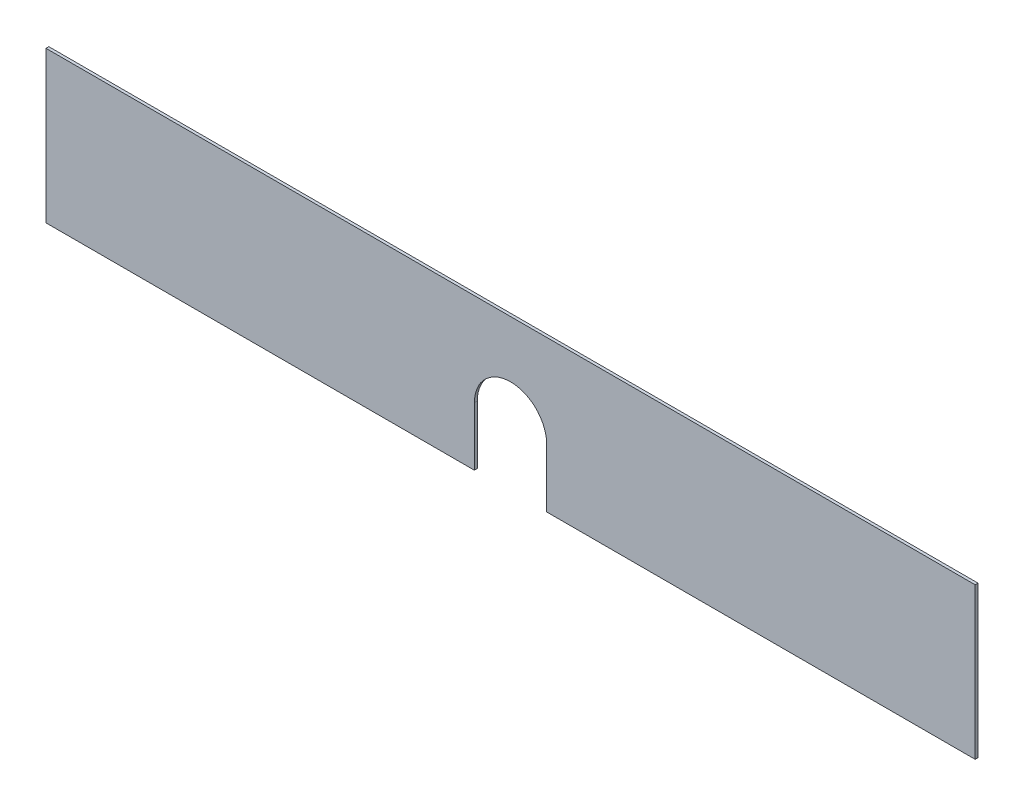
ISO-10303-21;
HEADER;
FILE_DESCRIPTION(('STEP AP214'),'2;1');
FILE_NAME('part.step','',(''),(''),'','','');
FILE_SCHEMA(('AUTOMOTIVE_DESIGN { 1 0 10303 214 1 1 1 1 }'));
ENDSEC;
DATA;
#1=APPLICATION_CONTEXT('core data for automotive mechanical design processes');
#2=APPLICATION_PROTOCOL_DEFINITION('international standard','automotive_design',2000,#1);
#3=PRODUCT_CONTEXT('',#1,'mechanical');
#4=PRODUCT('Part','Part','',(#3));
#5=PRODUCT_RELATED_PRODUCT_CATEGORY('part','',(#4));
#6=PRODUCT_DEFINITION_FORMATION('','',#4);
#7=PRODUCT_DEFINITION_CONTEXT('part definition',#1,'design');
#8=PRODUCT_DEFINITION('design','',#6,#7);
#9=PRODUCT_DEFINITION_SHAPE('','',#8);
#10=(LENGTH_UNIT() NAMED_UNIT(*) SI_UNIT(.MILLI.,.METRE.));
#11=(NAMED_UNIT(*) PLANE_ANGLE_UNIT() SI_UNIT($,.RADIAN.));
#12=(NAMED_UNIT(*) SI_UNIT($,.STERADIAN.) SOLID_ANGLE_UNIT());
#13=UNCERTAINTY_MEASURE_WITH_UNIT(LENGTH_MEASURE(1.E-05),#10,'distance_accuracy_value','');
#14=(GEOMETRIC_REPRESENTATION_CONTEXT(3) GLOBAL_UNCERTAINTY_ASSIGNED_CONTEXT((#13)) GLOBAL_UNIT_ASSIGNED_CONTEXT((#10,
#11,#12)) REPRESENTATION_CONTEXT('',''));
#15=CARTESIAN_POINT('',(0.,0.,0.));
#16=DIRECTION('',(0.,0.,1.));
#17=DIRECTION('',(1.,0.,0.));
#18=AXIS2_PLACEMENT_3D('',#15,#16,#17);
#19=CARTESIAN_POINT('',(150.175,0.,1.));
#20=DIRECTION('',(0.,1.,0.));
#21=DIRECTION('',(-1.,0.,0.));
#22=AXIS2_PLACEMENT_3D('',#19,#20,#21);
#23=PLANE('',#22);
#24=DIRECTION('',(1.,0.,0.));
#25=VECTOR('',#24,1.);
#26=CARTESIAN_POINT('',(150.175,0.,0.));
#27=LINE('',#26,#25);
#28=CARTESIAN_POINT('',(0.,0.,0.));
#29=VERTEX_POINT('',#28);
#30=CARTESIAN_POINT('',(150.175,0.,0.));
#31=VERTEX_POINT('',#30);
#32=EDGE_CURVE('E131',#29,#31,#27,.T.);
#33=ORIENTED_EDGE('',*,*,#32,.T.);
#34=DIRECTION('',(0.,0.,-1.));
#35=VECTOR('',#34,1.);
#36=CARTESIAN_POINT('',(150.175,0.,1.));
#37=LINE('',#36,#35);
#38=CARTESIAN_POINT('',(150.175,0.,1.));
#39=VERTEX_POINT('',#38);
#40=EDGE_CURVE('E11',#39,#31,#37,.T.);
#41=ORIENTED_EDGE('',*,*,#40,.F.);
#42=DIRECTION('',(1.,0.,0.));
#43=VECTOR('',#42,1.);
#44=CARTESIAN_POINT('',(150.175,0.,1.));
#45=LINE('',#44,#43);
#46=CARTESIAN_POINT('',(0.,0.,1.));
#47=VERTEX_POINT('',#46);
#48=EDGE_CURVE('E145',#47,#39,#45,.T.);
#49=ORIENTED_EDGE('',*,*,#48,.F.);
#50=DIRECTION('',(0.,0.,-1.));
#51=VECTOR('',#50,1.);
#52=CARTESIAN_POINT('',(0.,0.,1.));
#53=LINE('',#52,#51);
#54=EDGE_CURVE('E127',#47,#29,#53,.T.);
#55=ORIENTED_EDGE('',*,*,#54,.T.);
#56=EDGE_LOOP('',(#33,#41,#49,#55));
#57=FACE_BOUND('',#56,.T.);
#58=ADVANCED_FACE('F35',(#57),#23,.F.);
#59=CARTESIAN_POINT('',(150.175,20.5,1.));
#60=DIRECTION('',(-1.,0.,0.));
#61=DIRECTION('',(0.,0.,1.));
#62=AXIS2_PLACEMENT_3D('',#59,#60,#61);
#63=PLANE('',#62);
#64=DIRECTION('',(0.,1.,0.));
#65=VECTOR('',#64,1.);
#66=CARTESIAN_POINT('',(150.175,20.5,0.));
#67=LINE('',#66,#65);
#68=CARTESIAN_POINT('',(150.175,20.5,0.));
#69=VERTEX_POINT('',#68);
#70=EDGE_CURVE('E134',#31,#69,#67,.T.);
#71=ORIENTED_EDGE('',*,*,#70,.T.);
#72=DIRECTION('',(0.,0.,-1.));
#73=VECTOR('',#72,1.);
#74=CARTESIAN_POINT('',(150.175,20.5,1.));
#75=LINE('',#74,#73);
#76=CARTESIAN_POINT('',(150.175,20.5,1.));
#77=VERTEX_POINT('',#76);
#78=EDGE_CURVE('E43',#77,#69,#75,.T.);
#79=ORIENTED_EDGE('',*,*,#78,.F.);
#80=DIRECTION('',(0.,1.,0.));
#81=VECTOR('',#80,1.);
#82=CARTESIAN_POINT('',(150.175,20.5,1.));
#83=LINE('',#82,#81);
#84=EDGE_CURVE('E94',#39,#77,#83,.T.);
#85=ORIENTED_EDGE('',*,*,#84,.F.);
#86=ORIENTED_EDGE('',*,*,#40,.T.);
#87=EDGE_LOOP('',(#71,#79,#85,#86));
#88=FACE_BOUND('',#87,.T.);
#89=ADVANCED_FACE('F180',(#88),#63,.F.);
#90=CARTESIAN_POINT('',(162.855,20.5,1.));
#91=DIRECTION('',(0.,0.,-1.));
#92=DIRECTION('',(-1.,0.,0.));
#93=AXIS2_PLACEMENT_3D('',#90,#91,#92);
#94=CYLINDRICAL_SURFACE('',#93,12.68);
#95=CARTESIAN_POINT('',(162.855,20.5,0.));
#96=DIRECTION('',(0.,0.,-1.));
#97=DIRECTION('',(-1.,0.,0.));
#98=AXIS2_PLACEMENT_3D('',#95,#96,#97);
#99=CIRCLE('',#98,12.68);
#100=CARTESIAN_POINT('',(175.535,20.5,0.));
#101=VERTEX_POINT('',#100);
#102=EDGE_CURVE('E136',#69,#101,#99,.T.);
#103=ORIENTED_EDGE('',*,*,#102,.T.);
#104=DIRECTION('',(0.,0.,-1.));
#105=VECTOR('',#104,1.);
#106=CARTESIAN_POINT('',(175.535,20.5,1.));
#107=LINE('',#106,#105);
#108=CARTESIAN_POINT('',(175.535,20.5,1.));
#109=VERTEX_POINT('',#108);
#110=EDGE_CURVE('E152',#109,#101,#107,.T.);
#111=ORIENTED_EDGE('',*,*,#110,.F.);
#112=CARTESIAN_POINT('',(162.855,20.5,1.));
#113=DIRECTION('',(0.,0.,-1.));
#114=DIRECTION('',(-1.,0.,0.));
#115=AXIS2_PLACEMENT_3D('',#112,#113,#114);
#116=CIRCLE('',#115,12.68);
#117=EDGE_CURVE('E160',#77,#109,#116,.T.);
#118=ORIENTED_EDGE('',*,*,#117,.F.);
#119=ORIENTED_EDGE('',*,*,#78,.T.);
#120=EDGE_LOOP('',(#103,#111,#118,#119));
#121=FACE_BOUND('',#120,.T.);
#122=ADVANCED_FACE('F158',(#121),#94,.F.);
#123=CARTESIAN_POINT('',(175.535,20.5,1.));
#124=DIRECTION('',(1.,0.,0.));
#125=DIRECTION('',(0.,0.,-1.));
#126=AXIS2_PLACEMENT_3D('',#123,#124,#125);
#127=PLANE('',#126);
#128=DIRECTION('',(0.,-1.,0.));
#129=VECTOR('',#128,1.);
#130=CARTESIAN_POINT('',(175.535,20.5,0.));
#131=LINE('',#130,#129);
#132=CARTESIAN_POINT('',(175.535,0.,0.));
#133=VERTEX_POINT('',#132);
#134=EDGE_CURVE('E138',#101,#133,#131,.T.);
#135=ORIENTED_EDGE('',*,*,#134,.T.);
#136=DIRECTION('',(0.,0.,-1.));
#137=VECTOR('',#136,1.);
#138=CARTESIAN_POINT('',(175.535,0.,1.));
#139=LINE('',#138,#137);
#140=CARTESIAN_POINT('',(175.535,0.,1.));
#141=VERTEX_POINT('',#140);
#142=EDGE_CURVE('E149',#141,#133,#139,.T.);
#143=ORIENTED_EDGE('',*,*,#142,.F.);
#144=DIRECTION('',(0.,-1.,0.));
#145=VECTOR('',#144,1.);
#146=CARTESIAN_POINT('',(175.535,20.5,1.));
#147=LINE('',#146,#145);
#148=EDGE_CURVE('E172',#109,#141,#147,.T.);
#149=ORIENTED_EDGE('',*,*,#148,.F.);
#150=ORIENTED_EDGE('',*,*,#110,.T.);
#151=EDGE_LOOP('',(#135,#143,#149,#150));
#152=FACE_BOUND('',#151,.T.);
#153=ADVANCED_FACE('F168',(#152),#127,.F.);
#154=CARTESIAN_POINT('',(325.71,0.,1.));
#155=DIRECTION('',(0.,1.,0.));
#156=DIRECTION('',(-1.,0.,0.));
#157=AXIS2_PLACEMENT_3D('',#154,#155,#156);
#158=PLANE('',#157);
#159=DIRECTION('',(1.,0.,0.));
#160=VECTOR('',#159,1.);
#161=CARTESIAN_POINT('',(325.71,0.,0.));
#162=LINE('',#161,#160);
#163=CARTESIAN_POINT('',(325.71,0.,0.));
#164=VERTEX_POINT('',#163);
#165=EDGE_CURVE('E140',#133,#164,#162,.T.);
#166=ORIENTED_EDGE('',*,*,#165,.T.);
#167=DIRECTION('',(0.,0.,-1.));
#168=VECTOR('',#167,1.);
#169=CARTESIAN_POINT('',(325.71,0.,1.));
#170=LINE('',#169,#168);
#171=CARTESIAN_POINT('',(325.71,0.,1.));
#172=VERTEX_POINT('',#171);
#173=EDGE_CURVE('E122',#172,#164,#170,.T.);
#174=ORIENTED_EDGE('',*,*,#173,.F.);
#175=DIRECTION('',(1.,0.,0.));
#176=VECTOR('',#175,1.);
#177=CARTESIAN_POINT('',(325.71,0.,1.));
#178=LINE('',#177,#176);
#179=EDGE_CURVE('E113',#141,#172,#178,.T.);
#180=ORIENTED_EDGE('',*,*,#179,.F.);
#181=ORIENTED_EDGE('',*,*,#142,.T.);
#182=EDGE_LOOP('',(#166,#174,#180,#181));
#183=FACE_BOUND('',#182,.T.);
#184=ADVANCED_FACE('F171',(#183),#158,.F.);
#185=CARTESIAN_POINT('',(325.71,53.,1.));
#186=DIRECTION('',(-1.,0.,0.));
#187=DIRECTION('',(0.,0.,1.));
#188=AXIS2_PLACEMENT_3D('',#185,#186,#187);
#189=PLANE('',#188);
#190=DIRECTION('',(0.,1.,0.));
#191=VECTOR('',#190,1.);
#192=CARTESIAN_POINT('',(325.71,53.,0.));
#193=LINE('',#192,#191);
#194=CARTESIAN_POINT('',(325.71,53.,0.));
#195=VERTEX_POINT('',#194);
#196=EDGE_CURVE('E121',#164,#195,#193,.T.);
#197=ORIENTED_EDGE('',*,*,#196,.T.);
#198=DIRECTION('',(0.,0.,-1.));
#199=VECTOR('',#198,1.);
#200=CARTESIAN_POINT('',(325.71,53.,1.));
#201=LINE('',#200,#199);
#202=CARTESIAN_POINT('',(325.71,53.,1.));
#203=VERTEX_POINT('',#202);
#204=EDGE_CURVE('E118',#203,#195,#201,.T.);
#205=ORIENTED_EDGE('',*,*,#204,.F.);
#206=DIRECTION('',(0.,1.,0.));
#207=VECTOR('',#206,1.);
#208=CARTESIAN_POINT('',(325.71,53.,1.));
#209=LINE('',#208,#207);
#210=EDGE_CURVE('E107',#172,#203,#209,.T.);
#211=ORIENTED_EDGE('',*,*,#210,.F.);
#212=ORIENTED_EDGE('',*,*,#173,.T.);
#213=EDGE_LOOP('',(#197,#205,#211,#212));
#214=FACE_BOUND('',#213,.T.);
#215=ADVANCED_FACE('F119',(#214),#189,.F.);
#216=CARTESIAN_POINT('',(0.,53.,1.));
#217=DIRECTION('',(0.,-1.,0.));
#218=DIRECTION('',(0.,0.,-1.));
#219=AXIS2_PLACEMENT_3D('',#216,#217,#218);
#220=PLANE('',#219);
#221=DIRECTION('',(-1.,0.,0.));
#222=VECTOR('',#221,1.);
#223=CARTESIAN_POINT('',(0.,53.,0.));
#224=LINE('',#223,#222);
#225=CARTESIAN_POINT('',(0.,53.,0.));
#226=VERTEX_POINT('',#225);
#227=EDGE_CURVE('E80',#195,#226,#224,.T.);
#228=ORIENTED_EDGE('',*,*,#227,.T.);
#229=DIRECTION('',(0.,0.,-1.));
#230=VECTOR('',#229,1.);
#231=CARTESIAN_POINT('',(0.,53.,1.));
#232=LINE('',#231,#230);
#233=CARTESIAN_POINT('',(0.,53.,1.));
#234=VERTEX_POINT('',#233);
#235=EDGE_CURVE('E123',#234,#226,#232,.T.);
#236=ORIENTED_EDGE('',*,*,#235,.F.);
#237=DIRECTION('',(-1.,0.,0.));
#238=VECTOR('',#237,1.);
#239=CARTESIAN_POINT('',(0.,53.,1.));
#240=LINE('',#239,#238);
#241=EDGE_CURVE('E111',#203,#234,#240,.T.);
#242=ORIENTED_EDGE('',*,*,#241,.F.);
#243=ORIENTED_EDGE('',*,*,#204,.T.);
#244=EDGE_LOOP('',(#228,#236,#242,#243));
#245=FACE_BOUND('',#244,.T.);
#246=ADVANCED_FACE('F125',(#245),#220,.F.);
#247=CARTESIAN_POINT('',(0.,0.,1.));
#248=DIRECTION('',(1.,0.,0.));
#249=DIRECTION('',(0.,0.,-1.));
#250=AXIS2_PLACEMENT_3D('',#247,#248,#249);
#251=PLANE('',#250);
#252=DIRECTION('',(0.,-1.,0.));
#253=VECTOR('',#252,1.);
#254=CARTESIAN_POINT('',(0.,0.,0.));
#255=LINE('',#254,#253);
#256=EDGE_CURVE('E86',#226,#29,#255,.T.);
#257=ORIENTED_EDGE('',*,*,#256,.T.);
#258=ORIENTED_EDGE('',*,*,#54,.F.);
#259=DIRECTION('',(0.,-1.,0.));
#260=VECTOR('',#259,1.);
#261=CARTESIAN_POINT('',(0.,0.,1.));
#262=LINE('',#261,#260);
#263=EDGE_CURVE('E51',#234,#47,#262,.T.);
#264=ORIENTED_EDGE('',*,*,#263,.F.);
#265=ORIENTED_EDGE('',*,*,#235,.T.);
#266=EDGE_LOOP('',(#257,#258,#264,#265));
#267=FACE_BOUND('',#266,.T.);
#268=ADVANCED_FACE('F196',(#267),#251,.F.);
#269=CARTESIAN_POINT('',(162.855,20.5,1.));
#270=DIRECTION('',(0.,0.,-1.));
#271=DIRECTION('',(-1.,0.,0.));
#272=AXIS2_PLACEMENT_3D('',#269,#270,#271);
#273=PLANE('',#272);
#274=ORIENTED_EDGE('',*,*,#48,.T.);
#275=ORIENTED_EDGE('',*,*,#84,.T.);
#276=ORIENTED_EDGE('',*,*,#117,.T.);
#277=ORIENTED_EDGE('',*,*,#148,.T.);
#278=ORIENTED_EDGE('',*,*,#179,.T.);
#279=ORIENTED_EDGE('',*,*,#210,.T.);
#280=ORIENTED_EDGE('',*,*,#241,.T.);
#281=ORIENTED_EDGE('',*,*,#263,.T.);
#282=EDGE_LOOP('',(#274,#275,#276,#277,#278,#279,#280,#281));
#283=FACE_BOUND('',#282,.T.);
#284=ADVANCED_FACE('F109',(#283),#273,.F.);
#285=CARTESIAN_POINT('',(162.855,20.5,0.));
#286=DIRECTION('',(0.,0.,-1.));
#287=DIRECTION('',(-1.,0.,0.));
#288=AXIS2_PLACEMENT_3D('',#285,#286,#287);
#289=PLANE('',#288);
#290=ORIENTED_EDGE('',*,*,#32,.F.);
#291=ORIENTED_EDGE('',*,*,#256,.F.);
#292=ORIENTED_EDGE('',*,*,#227,.F.);
#293=ORIENTED_EDGE('',*,*,#196,.F.);
#294=ORIENTED_EDGE('',*,*,#165,.F.);
#295=ORIENTED_EDGE('',*,*,#134,.F.);
#296=ORIENTED_EDGE('',*,*,#102,.F.);
#297=ORIENTED_EDGE('',*,*,#70,.F.);
#298=EDGE_LOOP('',(#290,#291,#292,#293,#294,#295,#296,#297));
#299=FACE_BOUND('',#298,.T.);
#300=ADVANCED_FACE('F164',(#299),#289,.T.);
#301=CLOSED_SHELL('',(#58,#89,#122,#153,#184,#215,#246,#268,#284,#300));
#302=MANIFOLD_SOLID_BREP('B2',#301);
#303=ADVANCED_BREP_SHAPE_REPRESENTATION('',(#18,#302),#14);
#304=SHAPE_DEFINITION_REPRESENTATION(#9,#303);
ENDSEC;
END-ISO-10303-21;
